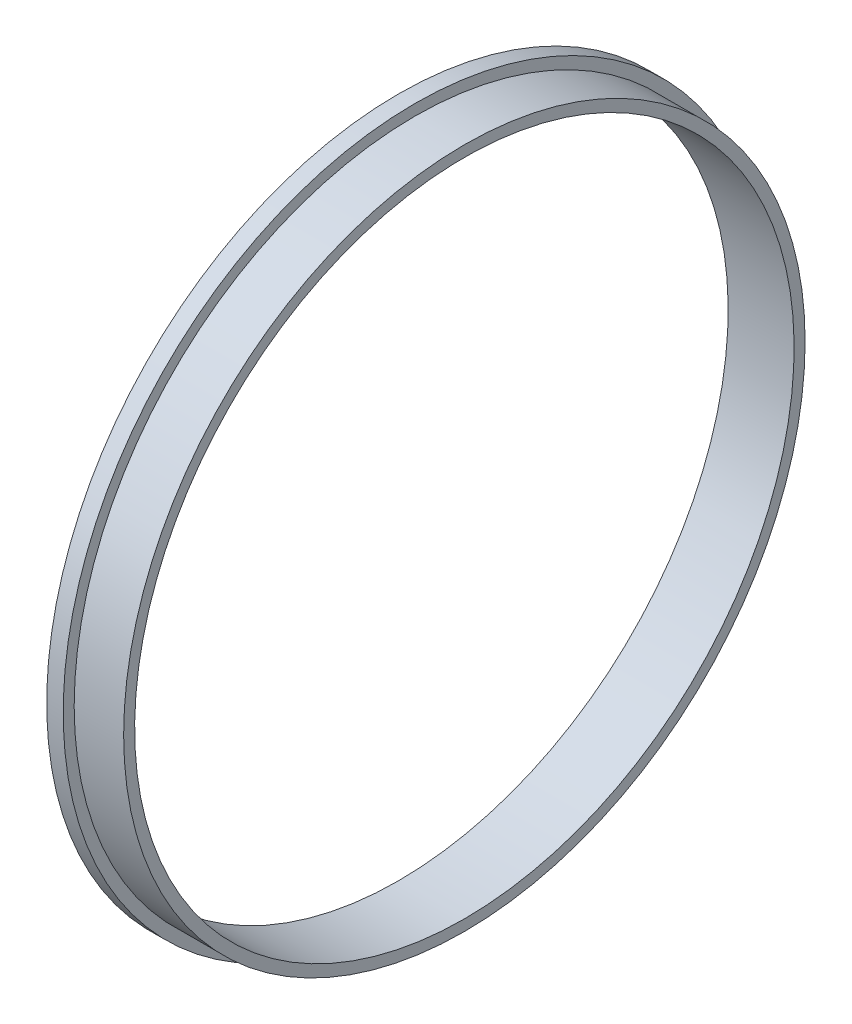
ISO-10303-21;
HEADER;
FILE_DESCRIPTION(('STEP AP214'),'2;1');
FILE_NAME('part.step','',(''),(''),'','','');
FILE_SCHEMA(('AUTOMOTIVE_DESIGN { 1 0 10303 214 1 1 1 1 }'));
ENDSEC;
DATA;
#1=APPLICATION_CONTEXT('core data for automotive mechanical design processes');
#2=APPLICATION_PROTOCOL_DEFINITION('international standard','automotive_design',2000,#1);
#3=PRODUCT_CONTEXT('',#1,'mechanical');
#4=PRODUCT('Part','Part','',(#3));
#5=PRODUCT_RELATED_PRODUCT_CATEGORY('part','',(#4));
#6=PRODUCT_DEFINITION_FORMATION('','',#4);
#7=PRODUCT_DEFINITION_CONTEXT('part definition',#1,'design');
#8=PRODUCT_DEFINITION('design','',#6,#7);
#9=PRODUCT_DEFINITION_SHAPE('','',#8);
#10=(LENGTH_UNIT() NAMED_UNIT(*) SI_UNIT(.MILLI.,.METRE.));
#11=(NAMED_UNIT(*) PLANE_ANGLE_UNIT() SI_UNIT($,.RADIAN.));
#12=(NAMED_UNIT(*) SI_UNIT($,.STERADIAN.) SOLID_ANGLE_UNIT());
#13=UNCERTAINTY_MEASURE_WITH_UNIT(LENGTH_MEASURE(1.E-05),#10,'distance_accuracy_value','');
#14=(GEOMETRIC_REPRESENTATION_CONTEXT(3) GLOBAL_UNCERTAINTY_ASSIGNED_CONTEXT((#13)) GLOBAL_UNIT_ASSIGNED_CONTEXT((#10,
#11,#12)) REPRESENTATION_CONTEXT('',''));
#15=CARTESIAN_POINT('',(0.,0.,0.));
#16=DIRECTION('',(0.,0.,1.));
#17=DIRECTION('',(1.,0.,0.));
#18=AXIS2_PLACEMENT_3D('',#15,#16,#17);
#19=CARTESIAN_POINT('',(1.5,0.,0.));
#20=DIRECTION('',(1.,0.,0.));
#21=DIRECTION('',(0.,1.,0.));
#22=AXIS2_PLACEMENT_3D('',#19,#20,#21);
#23=CYLINDRICAL_SURFACE('',#22,64.);
#24=CARTESIAN_POINT('',(3.,0.,0.));
#25=DIRECTION('',(1.,0.,0.));
#26=DIRECTION('',(0.,0.,-1.));
#27=AXIS2_PLACEMENT_3D('',#24,#25,#26);
#28=CIRCLE('',#27,64.);
#29=CARTESIAN_POINT('',(3.,-64.,0.));
#30=VERTEX_POINT('',#29);
#31=EDGE_CURVE('E21',#30,#30,#28,.T.);
#32=ORIENTED_EDGE('',*,*,#31,.F.);
#33=DIRECTION('',(-1.,0.,0.));
#34=VECTOR('',#33,1.);
#35=CARTESIAN_POINT('',(1.5,-64.,0.));
#36=LINE('',#35,#34);
#37=CARTESIAN_POINT('',(0.,-64.,0.));
#38=VERTEX_POINT('',#37);
#39=EDGE_CURVE('E11',#30,#38,#36,.T.);
#40=ORIENTED_EDGE('',*,*,#39,.T.);
#41=CARTESIAN_POINT('',(0.,0.,0.));
#42=DIRECTION('',(1.,0.,0.));
#43=DIRECTION('',(0.,0.,-1.));
#44=AXIS2_PLACEMENT_3D('',#41,#42,#43);
#45=CIRCLE('',#44,64.);
#46=EDGE_CURVE('E28',#38,#38,#45,.T.);
#47=ORIENTED_EDGE('',*,*,#46,.T.);
#48=ORIENTED_EDGE('',*,*,#39,.F.);
#49=EDGE_LOOP('',(#32,#40,#47,#48));
#50=FACE_BOUND('',#49,.T.);
#51=ADVANCED_FACE('F17',(#50),#23,.T.);
#52=CARTESIAN_POINT('',(0.,64.,0.));
#53=DIRECTION('',(-1.,0.,0.));
#54=DIRECTION('',(0.,0.,1.));
#55=AXIS2_PLACEMENT_3D('',#52,#53,#54);
#56=PLANE('',#55);
#57=CARTESIAN_POINT('',(0.,0.,0.));
#58=DIRECTION('',(1.,0.,0.));
#59=DIRECTION('',(0.,0.,-1.));
#60=AXIS2_PLACEMENT_3D('',#57,#58,#59);
#61=CIRCLE('',#60,60.);
#62=CARTESIAN_POINT('',(0.,-60.,0.));
#63=VERTEX_POINT('',#62);
#64=EDGE_CURVE('E70',#63,#63,#61,.T.);
#65=ORIENTED_EDGE('',*,*,#64,.T.);
#66=EDGE_LOOP('',(#65));
#67=FACE_BOUND('',#66,.T.);
#68=ORIENTED_EDGE('',*,*,#46,.F.);
#69=EDGE_LOOP('',(#68));
#70=FACE_BOUND('',#69,.T.);
#71=ADVANCED_FACE('F157',(#67,#70),#56,.T.);
#72=CARTESIAN_POINT('',(6.,0.,0.));
#73=DIRECTION('',(1.,0.,0.));
#74=DIRECTION('',(0.,1.,0.));
#75=AXIS2_PLACEMENT_3D('',#72,#73,#74);
#76=CYLINDRICAL_SURFACE('',#75,60.);
#77=CARTESIAN_POINT('',(12.,0.,0.));
#78=DIRECTION('',(1.,0.,0.));
#79=DIRECTION('',(0.,0.,-1.));
#80=AXIS2_PLACEMENT_3D('',#77,#78,#79);
#81=CIRCLE('',#80,60.);
#82=CARTESIAN_POINT('',(12.,-60.,0.));
#83=VERTEX_POINT('',#82);
#84=EDGE_CURVE('E69',#83,#83,#81,.T.);
#85=ORIENTED_EDGE('',*,*,#84,.T.);
#86=DIRECTION('',(-1.,0.,0.));
#87=VECTOR('',#86,1.);
#88=CARTESIAN_POINT('',(6.,-60.,0.));
#89=LINE('',#88,#87);
#90=EDGE_CURVE('E66',#83,#63,#89,.T.);
#91=ORIENTED_EDGE('',*,*,#90,.T.);
#92=ORIENTED_EDGE('',*,*,#64,.F.);
#93=ORIENTED_EDGE('',*,*,#90,.F.);
#94=EDGE_LOOP('',(#85,#91,#92,#93));
#95=FACE_BOUND('',#94,.T.);
#96=ADVANCED_FACE('F67',(#95),#76,.F.);
#97=CARTESIAN_POINT('',(12.,60.,0.));
#98=DIRECTION('',(1.,0.,0.));
#99=DIRECTION('',(0.,1.,0.));
#100=AXIS2_PLACEMENT_3D('',#97,#98,#99);
#101=PLANE('',#100);
#102=ORIENTED_EDGE('',*,*,#84,.F.);
#103=EDGE_LOOP('',(#102));
#104=FACE_BOUND('',#103,.T.);
#105=CARTESIAN_POINT('',(12.,0.,0.));
#106=DIRECTION('',(1.,0.,0.));
#107=DIRECTION('',(0.,0.,-1.));
#108=AXIS2_PLACEMENT_3D('',#105,#106,#107);
#109=CIRCLE('',#108,62.);
#110=CARTESIAN_POINT('',(12.,-62.,0.));
#111=VERTEX_POINT('',#110);
#112=EDGE_CURVE('E84',#111,#111,#109,.T.);
#113=ORIENTED_EDGE('',*,*,#112,.T.);
#114=EDGE_LOOP('',(#113));
#115=FACE_BOUND('',#114,.T.);
#116=ADVANCED_FACE('F93',(#104,#115),#101,.T.);
#117=CARTESIAN_POINT('',(7.5,0.,0.));
#118=DIRECTION('',(1.,0.,0.));
#119=DIRECTION('',(0.,1.,0.));
#120=AXIS2_PLACEMENT_3D('',#117,#118,#119);
#121=CYLINDRICAL_SURFACE('',#120,62.);
#122=ORIENTED_EDGE('',*,*,#112,.F.);
#123=DIRECTION('',(-1.,0.,0.));
#124=VECTOR('',#123,1.);
#125=CARTESIAN_POINT('',(7.5,-62.,0.));
#126=LINE('',#125,#124);
#127=CARTESIAN_POINT('',(3.,-62.,0.));
#128=VERTEX_POINT('',#127);
#129=EDGE_CURVE('E56',#111,#128,#126,.T.);
#130=ORIENTED_EDGE('',*,*,#129,.T.);
#131=CARTESIAN_POINT('',(3.,0.,0.));
#132=DIRECTION('',(1.,0.,0.));
#133=DIRECTION('',(0.,0.,-1.));
#134=AXIS2_PLACEMENT_3D('',#131,#132,#133);
#135=CIRCLE('',#134,62.);
#136=EDGE_CURVE('E81',#128,#128,#135,.T.);
#137=ORIENTED_EDGE('',*,*,#136,.T.);
#138=ORIENTED_EDGE('',*,*,#129,.F.);
#139=EDGE_LOOP('',(#122,#130,#137,#138));
#140=FACE_BOUND('',#139,.T.);
#141=ADVANCED_FACE('F94',(#140),#121,.T.);
#142=CARTESIAN_POINT('',(3.,62.,0.));
#143=DIRECTION('',(1.,0.,0.));
#144=DIRECTION('',(0.,1.,0.));
#145=AXIS2_PLACEMENT_3D('',#142,#143,#144);
#146=PLANE('',#145);
#147=ORIENTED_EDGE('',*,*,#136,.F.);
#148=EDGE_LOOP('',(#147));
#149=FACE_BOUND('',#148,.T.);
#150=ORIENTED_EDGE('',*,*,#31,.T.);
#151=EDGE_LOOP('',(#150));
#152=FACE_BOUND('',#151,.T.);
#153=ADVANCED_FACE('F19',(#149,#152),#146,.T.);
#154=CLOSED_SHELL('',(#51,#71,#96,#116,#141,#153));
#155=MANIFOLD_SOLID_BREP('B1',#154);
#156=ADVANCED_BREP_SHAPE_REPRESENTATION('',(#18,#155),#14);
#157=SHAPE_DEFINITION_REPRESENTATION(#9,#156);
ENDSEC;
END-ISO-10303-21;
